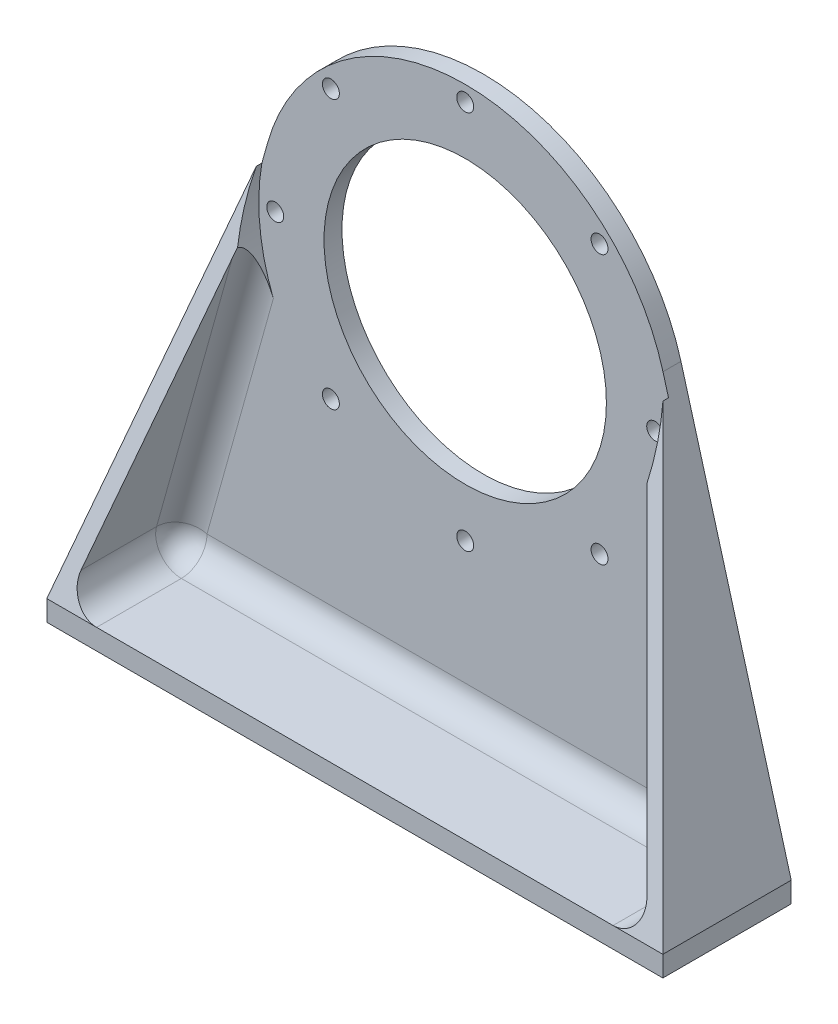
ISO-10303-21;
HEADER;
FILE_DESCRIPTION(('STEP AP214'),'2;1');
FILE_NAME('part.step','',(''),(''),'','','');
FILE_SCHEMA(('AUTOMOTIVE_DESIGN { 1 0 10303 214 1 1 1 1 }'));
ENDSEC;
DATA;
#1=APPLICATION_CONTEXT('core data for automotive mechanical design processes');
#2=APPLICATION_PROTOCOL_DEFINITION('international standard','automotive_design',2000,#1);
#3=PRODUCT_CONTEXT('',#1,'mechanical');
#4=PRODUCT('Part','Part','',(#3));
#5=PRODUCT_RELATED_PRODUCT_CATEGORY('part','',(#4));
#6=PRODUCT_DEFINITION_FORMATION('','',#4);
#7=PRODUCT_DEFINITION_CONTEXT('part definition',#1,'design');
#8=PRODUCT_DEFINITION('design','',#6,#7);
#9=PRODUCT_DEFINITION_SHAPE('','',#8);
#10=(LENGTH_UNIT() NAMED_UNIT(*) SI_UNIT(.MILLI.,.METRE.));
#11=(NAMED_UNIT(*) PLANE_ANGLE_UNIT() SI_UNIT($,.RADIAN.));
#12=(NAMED_UNIT(*) SI_UNIT($,.STERADIAN.) SOLID_ANGLE_UNIT());
#13=UNCERTAINTY_MEASURE_WITH_UNIT(LENGTH_MEASURE(1.E-05),#10,'distance_accuracy_value','');
#14=(GEOMETRIC_REPRESENTATION_CONTEXT(3) GLOBAL_UNCERTAINTY_ASSIGNED_CONTEXT((#13)) GLOBAL_UNIT_ASSIGNED_CONTEXT((#10,
#11,#12)) REPRESENTATION_CONTEXT('',''));
#15=CARTESIAN_POINT('',(0.,0.,0.));
#16=DIRECTION('',(0.,0.,1.));
#17=DIRECTION('',(1.,0.,0.));
#18=AXIS2_PLACEMENT_3D('',#15,#16,#17);
#19=CARTESIAN_POINT('',(37.,-1.29184809537196E-13,25.));
#20=DIRECTION('',(0.,0.,-1.));
#21=DIRECTION('',(-1.,0.,0.));
#22=AXIS2_PLACEMENT_3D('',#19,#20,#21);
#23=CYLINDRICAL_SURFACE('',#22,1.65);
#24=CARTESIAN_POINT('',(37.,-1.29184809537196E-13,0.));
#25=DIRECTION('',(0.,0.,1.));
#26=DIRECTION('',(1.,0.,0.));
#27=AXIS2_PLACEMENT_3D('',#24,#25,#26);
#28=CIRCLE('',#27,1.65);
#29=CARTESIAN_POINT('',(38.65,-1.29184809537196E-13,0.));
#30=VERTEX_POINT('',#29);
#31=EDGE_CURVE('E448',#30,#30,#28,.T.);
#32=ORIENTED_EDGE('',*,*,#31,.F.);
#33=EDGE_LOOP('',(#32));
#34=FACE_BOUND('',#33,.T.);
#35=CARTESIAN_POINT('',(37.,-1.29184809537196E-13,3.5));
#36=DIRECTION('',(0.,0.,1.));
#37=DIRECTION('',(1.,0.,0.));
#38=AXIS2_PLACEMENT_3D('',#35,#36,#37);
#39=CIRCLE('',#38,1.65);
#40=CARTESIAN_POINT('',(38.65,-1.29184809537196E-13,3.5));
#41=VERTEX_POINT('',#40);
#42=EDGE_CURVE('E396',#41,#41,#39,.T.);
#43=ORIENTED_EDGE('',*,*,#42,.T.);
#44=EDGE_LOOP('',(#43));
#45=FACE_BOUND('',#44,.T.);
#46=ADVANCED_FACE('F47',(#34,#45),#23,.F.);
#47=CARTESIAN_POINT('',(35.6318868512635,9.96838198599715,25.));
#48=DIRECTION('',(-0.963023968953069,-0.269415729351274,0.));
#49=DIRECTION('',(0.269415729351274,-0.963023968953069,0.));
#50=AXIS2_PLACEMENT_3D('',#47,#48,#49);
#51=PLANE('',#50);
#52=DIRECTION('',(-0.269415729351274,0.963023968953069,0.));
#53=VECTOR('',#52,1.);
#54=CARTESIAN_POINT('',(56.8848127391249,-66.,8.5));
#55=LINE('',#54,#53);
#56=CARTESIAN_POINT('',(40.4008973674516,-7.07840086642601,8.5));
#57=VERTEX_POINT('',#56);
#58=CARTESIAN_POINT('',(55.1091530691742,-59.6529213532436,8.5));
#59=VERTEX_POINT('',#58);
#60=EDGE_CURVE('E175',#57,#59,#55,.F.);
#61=ORIENTED_EDGE('',*,*,#60,.T.);
#62=DIRECTION('',(0.,0.,-1.));
#63=VECTOR('',#62,1.);
#64=CARTESIAN_POINT('',(55.1091530691742,-59.6529213532436,25.));
#65=LINE('',#64,#63);
#66=CARTESIAN_POINT('',(55.1091530691742,-59.6529213532436,23.222607681878));
#67=VERTEX_POINT('',#66);
#68=EDGE_CURVE('E183',#59,#67,#65,.F.);
#69=ORIENTED_EDGE('',*,*,#68,.T.);
#70=DIRECTION('',(-0.260122806675795,0.929806505000007,-0.260376628572496));
#71=VECTOR('',#70,1.);
#72=CARTESIAN_POINT('',(37.072749974743,4.81803041880216,5.16860507704013));
#73=LINE('',#72,#71);
#74=EDGE_CURVE('E159',#67,#57,#73,.T.);
#75=ORIENTED_EDGE('',*,*,#74,.T.);
#76=EDGE_LOOP('',(#61,#69,#75));
#77=FACE_BOUND('',#76,.T.);
#78=ADVANCED_FACE('F273',(#77),#51,.T.);
#79=CARTESIAN_POINT('',(-35.6318868512635,9.96838198599715,25.));
#80=DIRECTION('',(-0.963023968953069,0.269415729351274,0.));
#81=DIRECTION('',(-0.269415729351274,-0.963023968953069,0.));
#82=AXIS2_PLACEMENT_3D('',#79,#80,#81);
#83=PLANE('',#82);
#84=DIRECTION('',(0.260122806675795,0.929806505000007,-0.260376628572496));
#85=VECTOR('',#84,1.);
#86=CARTESIAN_POINT('',(-37.072749974743,4.81803041880217,5.16860507704013));
#87=LINE('',#86,#85);
#88=CARTESIAN_POINT('',(-55.1091530691742,-59.6529213532436,23.222607681878));
#89=VERTEX_POINT('',#88);
#90=CARTESIAN_POINT('',(-40.4008973674516,-7.07840086642601,8.5));
#91=VERTEX_POINT('',#90);
#92=EDGE_CURVE('E345',#89,#91,#87,.T.);
#93=ORIENTED_EDGE('',*,*,#92,.F.);
#94=DIRECTION('',(0.,0.,-1.));
#95=VECTOR('',#94,1.);
#96=CARTESIAN_POINT('',(-55.1091530691742,-59.6529213532436,25.));
#97=LINE('',#96,#95);
#98=CARTESIAN_POINT('',(-55.1091530691742,-59.6529213532436,8.5));
#99=VERTEX_POINT('',#98);
#100=EDGE_CURVE('E177',#89,#99,#97,.T.);
#101=ORIENTED_EDGE('',*,*,#100,.T.);
#102=DIRECTION('',(0.269415729351274,0.963023968953069,0.));
#103=VECTOR('',#102,1.);
#104=CARTESIAN_POINT('',(-35.6318868512635,9.96838198599715,8.5));
#105=LINE('',#104,#103);
#106=EDGE_CURVE('E348',#99,#91,#105,.T.);
#107=ORIENTED_EDGE('',*,*,#106,.T.);
#108=EDGE_LOOP('',(#93,#101,#107));
#109=FACE_BOUND('',#108,.T.);
#110=ADVANCED_FACE('F269',(#109),#83,.F.);
#111=CARTESIAN_POINT('',(-37.,3.87554428611588E-13,25.));
#112=DIRECTION('',(0.,0.,-1.));
#113=DIRECTION('',(-1.,0.,0.));
#114=AXIS2_PLACEMENT_3D('',#111,#112,#113);
#115=CYLINDRICAL_SURFACE('',#114,1.65);
#116=CARTESIAN_POINT('',(-37.,3.87554428611588E-13,0.));
#117=DIRECTION('',(0.,0.,1.));
#118=DIRECTION('',(1.,0.,0.));
#119=AXIS2_PLACEMENT_3D('',#116,#117,#118);
#120=CIRCLE('',#119,1.65);
#121=CARTESIAN_POINT('',(-35.35,3.87554428611588E-13,0.));
#122=VERTEX_POINT('',#121);
#123=EDGE_CURVE('E452',#122,#122,#120,.T.);
#124=ORIENTED_EDGE('',*,*,#123,.F.);
#125=EDGE_LOOP('',(#124));
#126=FACE_BOUND('',#125,.T.);
#127=CARTESIAN_POINT('',(-37.,3.87554428611588E-13,3.5));
#128=DIRECTION('',(0.,0.,1.));
#129=DIRECTION('',(1.,0.,0.));
#130=AXIS2_PLACEMENT_3D('',#127,#128,#129);
#131=CIRCLE('',#130,1.65);
#132=CARTESIAN_POINT('',(-35.35,3.87554428611588E-13,3.5));
#133=VERTEX_POINT('',#132);
#134=EDGE_CURVE('E392',#133,#133,#131,.T.);
#135=ORIENTED_EDGE('',*,*,#134,.T.);
#136=EDGE_LOOP('',(#135));
#137=FACE_BOUND('',#136,.T.);
#138=ADVANCED_FACE('F272',(#126,#137),#115,.F.);
#139=CARTESIAN_POINT('',(38.5209587581228,10.776629174051,25.));
#140=DIRECTION('',(-0.963023968953069,-0.269415729351274,0.));
#141=DIRECTION('',(0.269415729351274,-0.963023968953069,0.));
#142=AXIS2_PLACEMENT_3D('',#139,#140,#141);
#143=PLANE('',#142);
#144=DIRECTION('',(0.,0.,-1.));
#145=VECTOR('',#144,1.);
#146=CARTESIAN_POINT('',(39.5999679133012,6.91972118408798,93.5));
#147=LINE('',#146,#145);
#148=CARTESIAN_POINT('',(39.5999679133012,6.91972118408802,4.58006202768055));
#149=VERTEX_POINT('',#148);
#150=CARTESIAN_POINT('',(39.5999679133012,6.91972118408798,3.5));
#151=VERTEX_POINT('',#150);
#152=EDGE_CURVE('E542',#149,#151,#147,.T.);
#153=ORIENTED_EDGE('',*,*,#152,.F.);
#154=DIRECTION('',(-0.260122806675795,0.929806505000007,-0.260376628572496));
#155=VECTOR('',#154,1.);
#156=CARTESIAN_POINT('',(39.9771515955895,5.5714816896224,4.95761375719576));
#157=LINE('',#156,#155);
#158=CARTESIAN_POINT('',(60.,-66.,25.));
#159=VERTEX_POINT('',#158);
#160=EDGE_CURVE('E350',#159,#149,#157,.T.);
#161=ORIENTED_EDGE('',*,*,#160,.F.);
#162=DIRECTION('',(0.,0.,-1.));
#163=VECTOR('',#162,1.);
#164=CARTESIAN_POINT('',(60.,-66.,25.));
#165=LINE('',#164,#163);
#166=CARTESIAN_POINT('',(60.,-66.,0.));
#167=VERTEX_POINT('',#166);
#168=EDGE_CURVE('E486',#159,#167,#165,.T.);
#169=ORIENTED_EDGE('',*,*,#168,.T.);
#170=DIRECTION('',(-0.269415729351274,0.963023968953069,0.));
#171=VECTOR('',#170,1.);
#172=CARTESIAN_POINT('',(38.5209587581228,10.776629174051,0.));
#173=LINE('',#172,#171);
#174=CARTESIAN_POINT('',(38.5209587581228,10.776629174051,0.));
#175=VERTEX_POINT('',#174);
#176=EDGE_CURVE('E428',#167,#175,#173,.T.);
#177=ORIENTED_EDGE('',*,*,#176,.T.);
#178=DIRECTION('',(0.,0.,-1.));
#179=VECTOR('',#178,1.);
#180=CARTESIAN_POINT('',(38.5209587581228,10.776629174051,25.));
#181=LINE('',#180,#179);
#182=CARTESIAN_POINT('',(38.5209587581228,10.776629174051,3.5));
#183=VERTEX_POINT('',#182);
#184=EDGE_CURVE('E482',#183,#175,#181,.T.);
#185=ORIENTED_EDGE('',*,*,#184,.F.);
#186=DIRECTION('',(-0.269415729351274,0.963023968953069,0.));
#187=VECTOR('',#186,1.);
#188=CARTESIAN_POINT('',(38.5209587581228,10.776629174051,3.5));
#189=LINE('',#188,#187);
#190=EDGE_CURVE('E548',#151,#183,#189,.T.);
#191=ORIENTED_EDGE('',*,*,#190,.F.);
#192=EDGE_LOOP('',(#153,#161,#169,#177,#185,#191));
#193=FACE_BOUND('',#192,.T.);
#194=ADVANCED_FACE('F277',(#193),#143,.F.);
#195=CARTESIAN_POINT('',(-38.5209587581227,10.776629174051,25.));
#196=DIRECTION('',(-0.963023968953069,0.269415729351274,0.));
#197=DIRECTION('',(-0.269415729351274,-0.963023968953069,0.));
#198=AXIS2_PLACEMENT_3D('',#195,#196,#197);
#199=PLANE('',#198);
#200=DIRECTION('',(0.260122806675795,0.929806505000007,-0.260376628572496));
#201=VECTOR('',#200,1.);
#202=CARTESIAN_POINT('',(-39.9771515955895,5.57148168962241,4.95761375719576));
#203=LINE('',#202,#201);
#204=CARTESIAN_POINT('',(-60.,-66.,25.));
#205=VERTEX_POINT('',#204);
#206=CARTESIAN_POINT('',(-39.5999679133012,6.91972118408798,4.58006202768056));
#207=VERTEX_POINT('',#206);
#208=EDGE_CURVE('E142',#205,#207,#203,.T.);
#209=ORIENTED_EDGE('',*,*,#208,.T.);
#210=DIRECTION('',(0.,0.,-1.));
#211=VECTOR('',#210,1.);
#212=CARTESIAN_POINT('',(-39.5999679133012,6.9197211840879,93.5));
#213=LINE('',#212,#211);
#214=CARTESIAN_POINT('',(-39.5999679133012,6.9197211840879,3.5));
#215=VERTEX_POINT('',#214);
#216=EDGE_CURVE('E565',#207,#215,#213,.T.);
#217=ORIENTED_EDGE('',*,*,#216,.T.);
#218=DIRECTION('',(0.269415729351274,0.963023968953069,0.));
#219=VECTOR('',#218,1.);
#220=CARTESIAN_POINT('',(-38.5209587581227,10.776629174051,3.5));
#221=LINE('',#220,#219);
#222=CARTESIAN_POINT('',(-38.5209587581228,10.776629174051,3.5));
#223=VERTEX_POINT('',#222);
#224=EDGE_CURVE('E557',#215,#223,#221,.T.);
#225=ORIENTED_EDGE('',*,*,#224,.T.);
#226=DIRECTION('',(0.,0.,-1.));
#227=VECTOR('',#226,1.);
#228=CARTESIAN_POINT('',(-38.5209587581227,10.776629174051,25.));
#229=LINE('',#228,#227);
#230=CARTESIAN_POINT('',(-38.5209587581227,10.776629174051,0.));
#231=VERTEX_POINT('',#230);
#232=EDGE_CURVE('E478',#223,#231,#229,.T.);
#233=ORIENTED_EDGE('',*,*,#232,.T.);
#234=DIRECTION('',(0.269415729351274,0.963023968953069,0.));
#235=VECTOR('',#234,1.);
#236=CARTESIAN_POINT('',(-38.5209587581227,10.776629174051,0.));
#237=LINE('',#236,#235);
#238=CARTESIAN_POINT('',(-60.,-66.,0.));
#239=VERTEX_POINT('',#238);
#240=EDGE_CURVE('E436',#239,#231,#237,.T.);
#241=ORIENTED_EDGE('',*,*,#240,.F.);
#242=DIRECTION('',(0.,0.,-1.));
#243=VECTOR('',#242,1.);
#244=CARTESIAN_POINT('',(-60.,-66.,25.));
#245=LINE('',#244,#243);
#246=EDGE_CURVE('E474',#205,#239,#245,.T.);
#247=ORIENTED_EDGE('',*,*,#246,.F.);
#248=EDGE_LOOP('',(#209,#217,#225,#233,#241,#247));
#249=FACE_BOUND('',#248,.T.);
#250=ADVANCED_FACE('F229',(#249),#199,.T.);
#251=CARTESIAN_POINT('',(116.,-66.,25.));
#252=DIRECTION('',(0.,0.269659511355382,0.962955735190137));
#253=DIRECTION('',(0.,-0.962955735190137,0.269659511355382));
#254=AXIS2_PLACEMENT_3D('',#251,#252,#253);
#255=PLANE('',#254);
#256=DIRECTION('',(-1.,0.,0.));
#257=VECTOR('',#256,1.);
#258=CARTESIAN_POINT('',(116.,-66.,25.));
#259=LINE('',#258,#257);
#260=CARTESIAN_POINT('',(-50.2940332244089,-66.,25.));
#261=VERTEX_POINT('',#260);
#262=EDGE_CURVE('E80',#261,#205,#259,.T.);
#263=ORIENTED_EDGE('',*,*,#262,.F.);
#264=CARTESIAN_POINT('',(-50.2940332244089,-61.,23.5998343355724));
#265=DIRECTION('',(0.,0.269659511355382,0.962955735190137));
#266=DIRECTION('',(0.,0.962955735190137,-0.269659511355382));
#267=AXIS2_PLACEMENT_3D('',#264,#265,#266);
#268=ELLIPSE('',#267,5.19234666483683,5.);
#269=EDGE_CURVE('E164',#261,#89,#268,.F.);
#270=ORIENTED_EDGE('',*,*,#269,.T.);
#271=ORIENTED_EDGE('',*,*,#92,.T.);
#272=CARTESIAN_POINT('',(-35.2089185993264,-7.078400866426,8.5));
#273=DIRECTION('',(0.,0.269659511355382,0.962955735190137));
#274=DIRECTION('',(0.278987102398765,0.924721432157256,-0.25895263969339));
#275=AXIS2_PLACEMENT_3D('',#272,#273,#274);
#276=ELLIPSE('',#275,19.2538314040136,5.);
#277=CARTESIAN_POINT('',(-39.8576103237932,-5.23554192769497,7.98393843792107));
#278=VERTEX_POINT('',#277);
#279=EDGE_CURVE('E163',#91,#278,#276,.F.);
#280=ORIENTED_EDGE('',*,*,#279,.T.);
#281=CARTESIAN_POINT('',(0.,0.,6.51781322955511));
#282=DIRECTION('',(0.,0.269659511355382,0.962955735190137));
#283=DIRECTION('',(0.,0.962955735190137,-0.269659511355382));
#284=AXIS2_PLACEMENT_3D('',#281,#282,#283);
#285=ELLIPSE('',#284,41.7464671852881,40.2);
#286=EDGE_CURVE('E547',#278,#207,#285,.F.);
#287=ORIENTED_EDGE('',*,*,#286,.T.);
#288=ORIENTED_EDGE('',*,*,#208,.F.);
#289=EDGE_LOOP('',(#263,#270,#271,#280,#287,#288));
#290=FACE_BOUND('',#289,.T.);
#291=ADVANCED_FACE('F225',(#290),#255,.T.);
#292=ORIENTED_EDGE('',*,*,#160,.T.);
#293=CARTESIAN_POINT('',(0.,0.,6.51781322955511));
#294=DIRECTION('',(0.,0.269659511355382,0.962955735190137));
#295=DIRECTION('',(0.,0.962955735190137,-0.269659511355382));
#296=AXIS2_PLACEMENT_3D('',#293,#294,#295);
#297=ELLIPSE('',#296,41.7464671852881,40.2);
#298=CARTESIAN_POINT('',(39.8576103237932,-5.23554192769498,7.98393843792108));
#299=VERTEX_POINT('',#298);
#300=EDGE_CURVE('E67',#149,#299,#297,.F.);
#301=ORIENTED_EDGE('',*,*,#300,.T.);
#302=CARTESIAN_POINT('',(35.2089185993264,-7.078400866426,8.5));
#303=DIRECTION('',(0.,0.269659511355382,0.962955735190137));
#304=DIRECTION('',(0.278987102398765,-0.924721432157256,0.25895263969339));
#305=AXIS2_PLACEMENT_3D('',#302,#303,#304);
#306=ELLIPSE('',#305,19.2538314040136,5.);
#307=EDGE_CURVE('E11',#299,#57,#306,.F.);
#308=ORIENTED_EDGE('',*,*,#307,.T.);
#309=ORIENTED_EDGE('',*,*,#74,.F.);
#310=CARTESIAN_POINT('',(50.2940332244089,-61.,23.5998343355724));
#311=DIRECTION('',(0.,0.269659511355382,0.962955735190137));
#312=DIRECTION('',(0.,-0.962955735190137,0.269659511355382));
#313=AXIS2_PLACEMENT_3D('',#310,#311,#312);
#314=ELLIPSE('',#313,5.19234666483683,5.);
#315=CARTESIAN_POINT('',(50.2940332244089,-66.,25.));
#316=VERTEX_POINT('',#315);
#317=EDGE_CURVE('E156',#67,#316,#314,.F.);
#318=ORIENTED_EDGE('',*,*,#317,.T.);
#319=EDGE_CURVE('E129',#159,#316,#259,.T.);
#320=ORIENTED_EDGE('',*,*,#319,.F.);
#321=EDGE_LOOP('',(#292,#301,#308,#309,#318,#320));
#322=FACE_BOUND('',#321,.T.);
#323=ADVANCED_FACE('F157',(#322),#255,.T.);
#324=CARTESIAN_POINT('',(-26.1629509039019,26.1629509039026,25.));
#325=DIRECTION('',(0.,0.,-1.));
#326=DIRECTION('',(-1.,0.,0.));
#327=AXIS2_PLACEMENT_3D('',#324,#325,#326);
#328=CYLINDRICAL_SURFACE('',#327,1.65);
#329=CARTESIAN_POINT('',(-26.1629509039019,26.1629509039026,0.));
#330=DIRECTION('',(0.,0.,1.));
#331=DIRECTION('',(1.,0.,0.));
#332=AXIS2_PLACEMENT_3D('',#329,#330,#331);
#333=CIRCLE('',#332,1.65);
#334=CARTESIAN_POINT('',(-24.5129509039019,26.1629509039026,0.));
#335=VERTEX_POINT('',#334);
#336=EDGE_CURVE('E456',#335,#335,#333,.T.);
#337=ORIENTED_EDGE('',*,*,#336,.F.);
#338=EDGE_LOOP('',(#337));
#339=FACE_BOUND('',#338,.T.);
#340=CARTESIAN_POINT('',(-26.1629509039019,26.1629509039026,3.5));
#341=DIRECTION('',(0.,0.,1.));
#342=DIRECTION('',(1.,0.,0.));
#343=AXIS2_PLACEMENT_3D('',#340,#341,#342);
#344=CIRCLE('',#343,1.65);
#345=CARTESIAN_POINT('',(-24.5129509039019,26.1629509039026,3.5));
#346=VERTEX_POINT('',#345);
#347=EDGE_CURVE('E388',#346,#346,#344,.T.);
#348=ORIENTED_EDGE('',*,*,#347,.T.);
#349=EDGE_LOOP('',(#348));
#350=FACE_BOUND('',#349,.T.);
#351=ADVANCED_FACE('F264',(#339,#350),#328,.F.);
#352=CARTESIAN_POINT('',(0.,37.,25.));
#353=DIRECTION('',(0.,0.,-1.));
#354=DIRECTION('',(-1.,0.,0.));
#355=AXIS2_PLACEMENT_3D('',#352,#353,#354);
#356=CYLINDRICAL_SURFACE('',#355,1.65);
#357=CARTESIAN_POINT('',(0.,37.,0.));
#358=DIRECTION('',(0.,0.,1.));
#359=DIRECTION('',(1.,0.,0.));
#360=AXIS2_PLACEMENT_3D('',#357,#358,#359);
#361=CIRCLE('',#360,1.65);
#362=CARTESIAN_POINT('',(1.65,37.,0.));
#363=VERTEX_POINT('',#362);
#364=EDGE_CURVE('E460',#363,#363,#361,.T.);
#365=ORIENTED_EDGE('',*,*,#364,.F.);
#366=EDGE_LOOP('',(#365));
#367=FACE_BOUND('',#366,.T.);
#368=CARTESIAN_POINT('',(0.,37.,3.5));
#369=DIRECTION('',(0.,0.,1.));
#370=DIRECTION('',(1.,0.,0.));
#371=AXIS2_PLACEMENT_3D('',#368,#369,#370);
#372=CIRCLE('',#371,1.65);
#373=CARTESIAN_POINT('',(1.65,37.,3.5));
#374=VERTEX_POINT('',#373);
#375=EDGE_CURVE('E384',#374,#374,#372,.T.);
#376=ORIENTED_EDGE('',*,*,#375,.T.);
#377=EDGE_LOOP('',(#376));
#378=FACE_BOUND('',#377,.T.);
#379=ADVANCED_FACE('F261',(#367,#378),#356,.F.);
#380=CARTESIAN_POINT('',(0.,0.,25.));
#381=DIRECTION('',(0.,0.,-1.));
#382=DIRECTION('',(-1.,0.,0.));
#383=AXIS2_PLACEMENT_3D('',#380,#381,#382);
#384=CYLINDRICAL_SURFACE('',#383,40.);
#385=CARTESIAN_POINT('',(0.,0.,3.5));
#386=DIRECTION('',(0.,0.,1.));
#387=DIRECTION('',(1.,0.,0.));
#388=AXIS2_PLACEMENT_3D('',#385,#386,#387);
#389=CIRCLE('',#388,40.);
#390=EDGE_CURVE('E354',#183,#223,#389,.T.);
#391=ORIENTED_EDGE('',*,*,#390,.F.);
#392=ORIENTED_EDGE('',*,*,#184,.T.);
#393=CARTESIAN_POINT('',(0.,0.,0.));
#394=DIRECTION('',(0.,0.,1.));
#395=DIRECTION('',(1.,0.,0.));
#396=AXIS2_PLACEMENT_3D('',#393,#394,#395);
#397=CIRCLE('',#396,40.);
#398=EDGE_CURVE('E432',#175,#231,#397,.T.);
#399=ORIENTED_EDGE('',*,*,#398,.T.);
#400=ORIENTED_EDGE('',*,*,#232,.F.);
#401=EDGE_LOOP('',(#391,#392,#399,#400));
#402=FACE_BOUND('',#401,.T.);
#403=ADVANCED_FACE('F259',(#402),#384,.T.);
#404=CARTESIAN_POINT('',(26.1629509039023,26.1629509039022,25.));
#405=DIRECTION('',(0.,0.,-1.));
#406=DIRECTION('',(-1.,0.,0.));
#407=AXIS2_PLACEMENT_3D('',#404,#405,#406);
#408=CYLINDRICAL_SURFACE('',#407,1.65);
#409=CARTESIAN_POINT('',(26.1629509039023,26.1629509039022,0.));
#410=DIRECTION('',(0.,0.,1.));
#411=DIRECTION('',(1.,0.,0.));
#412=AXIS2_PLACEMENT_3D('',#409,#410,#411);
#413=CIRCLE('',#412,1.65);
#414=CARTESIAN_POINT('',(27.8129509039023,26.1629509039022,0.));
#415=VERTEX_POINT('',#414);
#416=EDGE_CURVE('E418',#415,#415,#413,.T.);
#417=ORIENTED_EDGE('',*,*,#416,.F.);
#418=EDGE_LOOP('',(#417));
#419=FACE_BOUND('',#418,.T.);
#420=CARTESIAN_POINT('',(26.1629509039023,26.1629509039022,3.5));
#421=DIRECTION('',(0.,0.,1.));
#422=DIRECTION('',(1.,0.,0.));
#423=AXIS2_PLACEMENT_3D('',#420,#421,#422);
#424=CIRCLE('',#423,1.65);
#425=CARTESIAN_POINT('',(27.8129509039023,26.1629509039022,3.5));
#426=VERTEX_POINT('',#425);
#427=EDGE_CURVE('E380',#426,#426,#424,.T.);
#428=ORIENTED_EDGE('',*,*,#427,.T.);
#429=EDGE_LOOP('',(#428));
#430=FACE_BOUND('',#429,.T.);
#431=ADVANCED_FACE('F252',(#419,#430),#408,.F.);
#432=CARTESIAN_POINT('',(0.,0.,25.));
#433=DIRECTION('',(0.,0.,1.));
#434=DIRECTION('',(1.,0.,0.));
#435=AXIS2_PLACEMENT_3D('',#432,#433,#434);
#436=PLANE('',#435);
#437=DIRECTION('',(0.,1.,0.));
#438=VECTOR('',#437,1.);
#439=CARTESIAN_POINT('',(60.,0.,25.));
#440=LINE('',#439,#438);
#441=CARTESIAN_POINT('',(60.,-70.,25.));
#442=VERTEX_POINT('',#441);
#443=EDGE_CURVE('E137',#442,#159,#440,.T.);
#444=ORIENTED_EDGE('',*,*,#443,.T.);
#445=ORIENTED_EDGE('',*,*,#319,.T.);
#446=DIRECTION('',(1.,0.,0.));
#447=VECTOR('',#446,1.);
#448=CARTESIAN_POINT('',(0.,-66.,25.));
#449=LINE('',#448,#447);
#450=EDGE_CURVE('E132',#261,#316,#449,.T.);
#451=ORIENTED_EDGE('',*,*,#450,.F.);
#452=ORIENTED_EDGE('',*,*,#262,.T.);
#453=DIRECTION('',(0.,1.,0.));
#454=VECTOR('',#453,1.);
#455=CARTESIAN_POINT('',(-60.,0.,25.));
#456=LINE('',#455,#454);
#457=CARTESIAN_POINT('',(-60.,-70.,25.));
#458=VERTEX_POINT('',#457);
#459=EDGE_CURVE('E417',#458,#205,#456,.T.);
#460=ORIENTED_EDGE('',*,*,#459,.F.);
#461=DIRECTION('',(-1.,0.,0.));
#462=VECTOR('',#461,1.);
#463=CARTESIAN_POINT('',(0.,-70.,25.));
#464=LINE('',#463,#462);
#465=EDGE_CURVE('E152',#442,#458,#464,.T.);
#466=ORIENTED_EDGE('',*,*,#465,.F.);
#467=EDGE_LOOP('',(#444,#445,#451,#452,#460,#466));
#468=FACE_BOUND('',#467,.T.);
#469=ADVANCED_FACE('F131',(#468),#436,.T.);
#470=CARTESIAN_POINT('',(0.,-66.,25.));
#471=DIRECTION('',(0.,1.,0.));
#472=DIRECTION('',(0.,0.,1.));
#473=AXIS2_PLACEMENT_3D('',#470,#471,#472);
#474=PLANE('',#473);
#475=DIRECTION('',(1.,0.,0.));
#476=VECTOR('',#475,1.);
#477=CARTESIAN_POINT('',(-56.8848127391249,-66.,8.5));
#478=LINE('',#477,#476);
#479=CARTESIAN_POINT('',(50.2940332244089,-66.,8.5));
#480=VERTEX_POINT('',#479);
#481=CARTESIAN_POINT('',(-50.2940332244089,-66.,8.5));
#482=VERTEX_POINT('',#481);
#483=EDGE_CURVE('E171',#480,#482,#478,.F.);
#484=ORIENTED_EDGE('',*,*,#483,.T.);
#485=DIRECTION('',(0.,0.,-1.));
#486=VECTOR('',#485,1.);
#487=CARTESIAN_POINT('',(-50.2940332244089,-66.,25.));
#488=LINE('',#487,#486);
#489=EDGE_CURVE('E149',#482,#261,#488,.F.);
#490=ORIENTED_EDGE('',*,*,#489,.T.);
#491=ORIENTED_EDGE('',*,*,#450,.T.);
#492=DIRECTION('',(0.,0.,-1.));
#493=VECTOR('',#492,1.);
#494=CARTESIAN_POINT('',(50.2940332244089,-66.,3.5));
#495=LINE('',#494,#493);
#496=EDGE_CURVE('E147',#316,#480,#495,.T.);
#497=ORIENTED_EDGE('',*,*,#496,.T.);
#498=EDGE_LOOP('',(#484,#490,#491,#497));
#499=FACE_BOUND('',#498,.T.);
#500=ADVANCED_FACE('F145',(#499),#474,.T.);
#501=CARTESIAN_POINT('',(60.,0.,25.));
#502=DIRECTION('',(-1.,0.,0.));
#503=DIRECTION('',(0.,0.,1.));
#504=AXIS2_PLACEMENT_3D('',#501,#502,#503);
#505=PLANE('',#504);
#506=DIRECTION('',(0.,1.,0.));
#507=VECTOR('',#506,1.);
#508=CARTESIAN_POINT('',(60.,0.,0.));
#509=LINE('',#508,#507);
#510=CARTESIAN_POINT('',(60.,-70.,0.));
#511=VERTEX_POINT('',#510);
#512=EDGE_CURVE('E400',#511,#167,#509,.T.);
#513=ORIENTED_EDGE('',*,*,#512,.T.);
#514=ORIENTED_EDGE('',*,*,#168,.F.);
#515=ORIENTED_EDGE('',*,*,#443,.F.);
#516=DIRECTION('',(0.,0.,-1.));
#517=VECTOR('',#516,1.);
#518=CARTESIAN_POINT('',(60.,-70.,25.));
#519=LINE('',#518,#517);
#520=EDGE_CURVE('E151',#442,#511,#519,.T.);
#521=ORIENTED_EDGE('',*,*,#520,.T.);
#522=EDGE_LOOP('',(#513,#514,#515,#521));
#523=FACE_BOUND('',#522,.T.);
#524=ADVANCED_FACE('F281',(#523),#505,.F.);
#525=CARTESIAN_POINT('',(-60.,0.,25.));
#526=DIRECTION('',(-1.,0.,0.));
#527=DIRECTION('',(0.,0.,1.));
#528=AXIS2_PLACEMENT_3D('',#525,#526,#527);
#529=PLANE('',#528);
#530=DIRECTION('',(0.,1.,0.));
#531=VECTOR('',#530,1.);
#532=CARTESIAN_POINT('',(-60.,0.,0.));
#533=LINE('',#532,#531);
#534=CARTESIAN_POINT('',(-60.,-70.,0.));
#535=VERTEX_POINT('',#534);
#536=EDGE_CURVE('E440',#535,#239,#533,.T.);
#537=ORIENTED_EDGE('',*,*,#536,.F.);
#538=DIRECTION('',(0.,0.,-1.));
#539=VECTOR('',#538,1.);
#540=CARTESIAN_POINT('',(-60.,-70.,25.));
#541=LINE('',#540,#539);
#542=EDGE_CURVE('E470',#458,#535,#541,.T.);
#543=ORIENTED_EDGE('',*,*,#542,.F.);
#544=ORIENTED_EDGE('',*,*,#459,.T.);
#545=ORIENTED_EDGE('',*,*,#246,.T.);
#546=EDGE_LOOP('',(#537,#543,#544,#545));
#547=FACE_BOUND('',#546,.T.);
#548=ADVANCED_FACE('F290',(#547),#529,.T.);
#549=CARTESIAN_POINT('',(0.,-70.,25.));
#550=DIRECTION('',(0.,-1.,0.));
#551=DIRECTION('',(0.,0.,-1.));
#552=AXIS2_PLACEMENT_3D('',#549,#550,#551);
#553=PLANE('',#552);
#554=DIRECTION('',(-1.,0.,0.));
#555=VECTOR('',#554,1.);
#556=CARTESIAN_POINT('',(0.,-70.,0.));
#557=LINE('',#556,#555);
#558=EDGE_CURVE('E444',#511,#535,#557,.T.);
#559=ORIENTED_EDGE('',*,*,#558,.F.);
#560=ORIENTED_EDGE('',*,*,#520,.F.);
#561=ORIENTED_EDGE('',*,*,#465,.T.);
#562=ORIENTED_EDGE('',*,*,#542,.T.);
#563=EDGE_LOOP('',(#559,#560,#561,#562));
#564=FACE_BOUND('',#563,.T.);
#565=ADVANCED_FACE('F255',(#564),#553,.T.);
#566=CARTESIAN_POINT('',(0.,0.,0.));
#567=DIRECTION('',(0.,0.,1.));
#568=DIRECTION('',(1.,0.,0.));
#569=AXIS2_PLACEMENT_3D('',#566,#567,#568);
#570=PLANE('',#569);
#571=ORIENTED_EDGE('',*,*,#416,.T.);
#572=EDGE_LOOP('',(#571));
#573=FACE_BOUND('',#572,.T.);
#574=ORIENTED_EDGE('',*,*,#364,.T.);
#575=EDGE_LOOP('',(#574));
#576=FACE_BOUND('',#575,.T.);
#577=ORIENTED_EDGE('',*,*,#336,.T.);
#578=EDGE_LOOP('',(#577));
#579=FACE_BOUND('',#578,.T.);
#580=ORIENTED_EDGE('',*,*,#31,.T.);
#581=EDGE_LOOP('',(#580));
#582=FACE_BOUND('',#581,.T.);
#583=ORIENTED_EDGE('',*,*,#123,.T.);
#584=EDGE_LOOP('',(#583));
#585=FACE_BOUND('',#584,.T.);
#586=ORIENTED_EDGE('',*,*,#512,.F.);
#587=ORIENTED_EDGE('',*,*,#558,.T.);
#588=ORIENTED_EDGE('',*,*,#536,.T.);
#589=ORIENTED_EDGE('',*,*,#240,.T.);
#590=ORIENTED_EDGE('',*,*,#398,.F.);
#591=ORIENTED_EDGE('',*,*,#176,.F.);
#592=EDGE_LOOP('',(#586,#587,#588,#589,#590,#591));
#593=FACE_BOUND('',#592,.T.);
#594=CARTESIAN_POINT('',(-26.1629509039025,-26.162950903902,0.));
#595=DIRECTION('',(0.,0.,1.));
#596=DIRECTION('',(1.,0.,0.));
#597=AXIS2_PLACEMENT_3D('',#594,#595,#596);
#598=CIRCLE('',#597,1.65);
#599=CARTESIAN_POINT('',(-24.5129509039025,-26.162950903902,0.));
#600=VERTEX_POINT('',#599);
#601=EDGE_CURVE('E362',#600,#600,#598,.T.);
#602=ORIENTED_EDGE('',*,*,#601,.T.);
#603=EDGE_LOOP('',(#602));
#604=FACE_BOUND('',#603,.T.);
#605=CARTESIAN_POINT('',(-2.58369619074392E-13,-37.,0.));
#606=DIRECTION('',(0.,0.,1.));
#607=DIRECTION('',(1.,0.,0.));
#608=AXIS2_PLACEMENT_3D('',#605,#606,#607);
#609=CIRCLE('',#608,1.65);
#610=CARTESIAN_POINT('',(1.64999999999974,-37.,0.));
#611=VERTEX_POINT('',#610);
#612=EDGE_CURVE('E404',#611,#611,#609,.T.);
#613=ORIENTED_EDGE('',*,*,#612,.T.);
#614=EDGE_LOOP('',(#613));
#615=FACE_BOUND('',#614,.T.);
#616=CARTESIAN_POINT('',(26.1629509039021,-26.1629509039024,0.));
#617=DIRECTION('',(0.,0.,1.));
#618=DIRECTION('',(1.,0.,0.));
#619=AXIS2_PLACEMENT_3D('',#616,#617,#618);
#620=CIRCLE('',#619,1.65);
#621=CARTESIAN_POINT('',(27.8129509039021,-26.1629509039024,0.));
#622=VERTEX_POINT('',#621);
#623=EDGE_CURVE('E408',#622,#622,#620,.T.);
#624=ORIENTED_EDGE('',*,*,#623,.T.);
#625=EDGE_LOOP('',(#624));
#626=FACE_BOUND('',#625,.T.);
#627=CARTESIAN_POINT('',(0.,0.,0.));
#628=DIRECTION('',(0.,0.,1.));
#629=DIRECTION('',(1.,0.,0.));
#630=AXIS2_PLACEMENT_3D('',#627,#628,#629);
#631=CIRCLE('',#630,27.5);
#632=CARTESIAN_POINT('',(27.5,0.,0.));
#633=VERTEX_POINT('',#632);
#634=EDGE_CURVE('E368',#633,#633,#631,.T.);
#635=ORIENTED_EDGE('',*,*,#634,.T.);
#636=EDGE_LOOP('',(#635));
#637=FACE_BOUND('',#636,.T.);
#638=ADVANCED_FACE('F238',(#573,#576,#579,#582,#585,#593,#604,#615,#626,#637),#570,.F.);
#639=CARTESIAN_POINT('',(0.,0.,3.5));
#640=DIRECTION('',(0.,0.,-1.));
#641=DIRECTION('',(-1.,0.,0.));
#642=AXIS2_PLACEMENT_3D('',#639,#640,#641);
#643=CYLINDRICAL_SURFACE('',#642,27.5);
#644=CARTESIAN_POINT('',(0.,0.,3.5));
#645=DIRECTION('',(0.,0.,1.));
#646=DIRECTION('',(1.,0.,0.));
#647=AXIS2_PLACEMENT_3D('',#644,#645,#646);
#648=CIRCLE('',#647,27.5);
#649=CARTESIAN_POINT('',(27.5,0.,3.5));
#650=VERTEX_POINT('',#649);
#651=EDGE_CURVE('E376',#650,#650,#648,.T.);
#652=ORIENTED_EDGE('',*,*,#651,.T.);
#653=EDGE_LOOP('',(#652));
#654=FACE_BOUND('',#653,.T.);
#655=ORIENTED_EDGE('',*,*,#634,.F.);
#656=EDGE_LOOP('',(#655));
#657=FACE_BOUND('',#656,.T.);
#658=ADVANCED_FACE('F234',(#654,#657),#643,.F.);
#659=CARTESIAN_POINT('',(26.1629509039021,-26.1629509039024,3.5));
#660=DIRECTION('',(0.,0.,-1.));
#661=DIRECTION('',(-1.,0.,0.));
#662=AXIS2_PLACEMENT_3D('',#659,#660,#661);
#663=CYLINDRICAL_SURFACE('',#662,1.65);
#664=CARTESIAN_POINT('',(26.1629509039021,-26.1629509039024,3.5));
#665=DIRECTION('',(0.,0.,1.));
#666=DIRECTION('',(1.,0.,0.));
#667=AXIS2_PLACEMENT_3D('',#664,#665,#666);
#668=CIRCLE('',#667,1.65);
#669=CARTESIAN_POINT('',(27.8129509039021,-26.1629509039024,3.5));
#670=VERTEX_POINT('',#669);
#671=EDGE_CURVE('E372',#670,#670,#668,.T.);
#672=ORIENTED_EDGE('',*,*,#671,.T.);
#673=EDGE_LOOP('',(#672));
#674=FACE_BOUND('',#673,.T.);
#675=ORIENTED_EDGE('',*,*,#623,.F.);
#676=EDGE_LOOP('',(#675));
#677=FACE_BOUND('',#676,.T.);
#678=ADVANCED_FACE('F237',(#674,#677),#663,.F.);
#679=CARTESIAN_POINT('',(-2.58369619074392E-13,-37.,3.5));
#680=DIRECTION('',(0.,0.,-1.));
#681=DIRECTION('',(-1.,0.,0.));
#682=AXIS2_PLACEMENT_3D('',#679,#680,#681);
#683=CYLINDRICAL_SURFACE('',#682,1.65);
#684=CARTESIAN_POINT('',(-2.58369619074392E-13,-37.,3.5));
#685=DIRECTION('',(0.,0.,1.));
#686=DIRECTION('',(1.,0.,0.));
#687=AXIS2_PLACEMENT_3D('',#684,#685,#686);
#688=CIRCLE('',#687,1.65);
#689=CARTESIAN_POINT('',(1.64999999999974,-37.,3.5));
#690=VERTEX_POINT('',#689);
#691=EDGE_CURVE('E367',#690,#690,#688,.T.);
#692=ORIENTED_EDGE('',*,*,#691,.T.);
#693=EDGE_LOOP('',(#692));
#694=FACE_BOUND('',#693,.T.);
#695=ORIENTED_EDGE('',*,*,#612,.F.);
#696=EDGE_LOOP('',(#695));
#697=FACE_BOUND('',#696,.T.);
#698=ADVANCED_FACE('F242',(#694,#697),#683,.F.);
#699=CARTESIAN_POINT('',(-26.1629509039025,-26.162950903902,3.5));
#700=DIRECTION('',(0.,0.,-1.));
#701=DIRECTION('',(-1.,0.,0.));
#702=AXIS2_PLACEMENT_3D('',#699,#700,#701);
#703=CYLINDRICAL_SURFACE('',#702,1.65);
#704=CARTESIAN_POINT('',(-26.1629509039025,-26.162950903902,3.5));
#705=DIRECTION('',(0.,0.,1.));
#706=DIRECTION('',(1.,0.,0.));
#707=AXIS2_PLACEMENT_3D('',#704,#705,#706);
#708=CIRCLE('',#707,1.65);
#709=CARTESIAN_POINT('',(-24.5129509039025,-26.162950903902,3.5));
#710=VERTEX_POINT('',#709);
#711=EDGE_CURVE('E363',#710,#710,#708,.T.);
#712=ORIENTED_EDGE('',*,*,#711,.T.);
#713=EDGE_LOOP('',(#712));
#714=FACE_BOUND('',#713,.T.);
#715=ORIENTED_EDGE('',*,*,#601,.F.);
#716=EDGE_LOOP('',(#715));
#717=FACE_BOUND('',#716,.T.);
#718=ADVANCED_FACE('F232',(#714,#717),#703,.F.);
#719=CARTESIAN_POINT('',(0.,0.,3.5));
#720=DIRECTION('',(0.,0.,1.));
#721=DIRECTION('',(1.,0.,0.));
#722=AXIS2_PLACEMENT_3D('',#719,#720,#721);
#723=PLANE('',#722);
#724=ORIENTED_EDGE('',*,*,#42,.F.);
#725=EDGE_LOOP('',(#724));
#726=FACE_BOUND('',#725,.T.);
#727=ORIENTED_EDGE('',*,*,#134,.F.);
#728=EDGE_LOOP('',(#727));
#729=FACE_BOUND('',#728,.T.);
#730=CARTESIAN_POINT('',(0.,0.,3.5));
#731=DIRECTION('',(0.,0.,1.));
#732=DIRECTION('',(1.,0.,0.));
#733=AXIS2_PLACEMENT_3D('',#730,#731,#732);
#734=CIRCLE('',#733,40.2);
#735=CARTESIAN_POINT('',(-37.3721560754064,-14.8108727047215,3.5));
#736=VERTEX_POINT('',#735);
#737=EDGE_CURVE('E122',#215,#736,#734,.T.);
#738=ORIENTED_EDGE('',*,*,#737,.T.);
#739=DIRECTION('',(0.269415729351274,0.963023968953069,0.));
#740=VECTOR('',#739,1.);
#741=CARTESIAN_POINT('',(-30.8167670064982,8.62130333924079,3.5));
#742=LINE('',#741,#740);
#743=CARTESIAN_POINT('',(-50.2940332244089,-61.,3.5));
#744=VERTEX_POINT('',#743);
#745=EDGE_CURVE('E193',#736,#744,#742,.F.);
#746=ORIENTED_EDGE('',*,*,#745,.T.);
#747=DIRECTION('',(1.,0.,0.));
#748=VECTOR('',#747,1.);
#749=CARTESIAN_POINT('',(56.8848127391249,-61.,3.5));
#750=LINE('',#749,#748);
#751=CARTESIAN_POINT('',(50.2940332244089,-61.,3.5));
#752=VERTEX_POINT('',#751);
#753=EDGE_CURVE('E190',#744,#752,#750,.T.);
#754=ORIENTED_EDGE('',*,*,#753,.T.);
#755=DIRECTION('',(-0.269415729351274,0.963023968953069,0.));
#756=VECTOR('',#755,1.);
#757=CARTESIAN_POINT('',(35.0513103931236,-6.5150318283877,3.5));
#758=LINE('',#757,#756);
#759=CARTESIAN_POINT('',(37.3721560754064,-14.8108727047215,3.5));
#760=VERTEX_POINT('',#759);
#761=EDGE_CURVE('E186',#752,#760,#758,.T.);
#762=ORIENTED_EDGE('',*,*,#761,.T.);
#763=EDGE_CURVE('E544',#760,#151,#734,.T.);
#764=ORIENTED_EDGE('',*,*,#763,.T.);
#765=ORIENTED_EDGE('',*,*,#190,.T.);
#766=ORIENTED_EDGE('',*,*,#390,.T.);
#767=ORIENTED_EDGE('',*,*,#224,.F.);
#768=EDGE_LOOP('',(#738,#746,#754,#762,#764,#765,#766,#767));
#769=FACE_BOUND('',#768,.T.);
#770=ORIENTED_EDGE('',*,*,#671,.F.);
#771=EDGE_LOOP('',(#770));
#772=FACE_BOUND('',#771,.T.);
#773=ORIENTED_EDGE('',*,*,#691,.F.);
#774=EDGE_LOOP('',(#773));
#775=FACE_BOUND('',#774,.T.);
#776=ORIENTED_EDGE('',*,*,#711,.F.);
#777=EDGE_LOOP('',(#776));
#778=FACE_BOUND('',#777,.T.);
#779=ORIENTED_EDGE('',*,*,#375,.F.);
#780=EDGE_LOOP('',(#779));
#781=FACE_BOUND('',#780,.T.);
#782=ORIENTED_EDGE('',*,*,#651,.F.);
#783=EDGE_LOOP('',(#782));
#784=FACE_BOUND('',#783,.T.);
#785=ORIENTED_EDGE('',*,*,#347,.F.);
#786=EDGE_LOOP('',(#785));
#787=FACE_BOUND('',#786,.T.);
#788=ORIENTED_EDGE('',*,*,#427,.F.);
#789=EDGE_LOOP('',(#788));
#790=FACE_BOUND('',#789,.T.);
#791=ADVANCED_FACE('F223',(#726,#729,#769,#772,#775,#778,#781,#784,#787,#790),#723,.T.);
#792=CARTESIAN_POINT('',(0.,0.,93.5));
#793=DIRECTION('',(0.,0.,-1.));
#794=DIRECTION('',(-1.,0.,0.));
#795=AXIS2_PLACEMENT_3D('',#792,#793,#794);
#796=CYLINDRICAL_SURFACE('',#795,40.2);
#797=ORIENTED_EDGE('',*,*,#300,.F.);
#798=ORIENTED_EDGE('',*,*,#152,.T.);
#799=ORIENTED_EDGE('',*,*,#763,.F.);
#800=CARTESIAN_POINT('',(37.3721560754064,-14.8108727047215,3.5));
#801=CARTESIAN_POINT('',(37.4449576139491,-14.6271819514633,3.50001224542248));
#802=CARTESIAN_POINT('',(37.5163914524377,-14.442970897166,3.50429091118265));
#803=CARTESIAN_POINT('',(37.6564087113638,-14.0738682607474,3.52096895541339));
#804=CARTESIAN_POINT('',(37.7249926253336,-13.888976802542,3.53336692154841));
#805=CARTESIAN_POINT('',(37.8592072350368,-13.5188456476848,3.56586853838919));
#806=CARTESIAN_POINT('',(37.9248385078379,-13.3336060265159,3.58597067600769));
#807=CARTESIAN_POINT('',(38.0530957755975,-12.9630382845673,3.63355890572508));
#808=CARTESIAN_POINT('',(38.1157216212537,-12.7777101598519,3.66104536421212));
#809=CARTESIAN_POINT('',(38.3002771386579,-12.218182085473,3.75481338214152));
#810=CARTESIAN_POINT('',(38.4175166999969,-11.844214820596,3.83206295318698));
#811=CARTESIAN_POINT('',(38.6392964873615,-11.099358166407,4.01426430514418));
#812=CARTESIAN_POINT('',(38.7438381799572,-10.728468426268,4.11921288244348));
#813=CARTESIAN_POINT('',(38.9122301365017,-10.0971594881369,4.323045467294));
#814=CARTESIAN_POINT('',(38.9791896732456,-9.83536239112361,4.41514371835743));
#815=CARTESIAN_POINT('',(39.1066175766973,-9.31579178088813,4.61416584457352));
#816=CARTESIAN_POINT('',(39.1670853627868,-9.05801862932427,4.72109104388252));
#817=CARTESIAN_POINT('',(39.2812754357454,-8.54921537587229,4.95048654116519));
#818=CARTESIAN_POINT('',(39.3350240232187,-8.29816221273704,5.0728921980679));
#819=CARTESIAN_POINT('',(39.4359681980471,-7.80434642980553,5.33557310132671));
#820=CARTESIAN_POINT('',(39.4831681682001,-7.56157834789728,5.47583627443112));
#821=CARTESIAN_POINT('',(39.5651348543244,-7.11925304264781,5.7579688678055));
#822=CARTESIAN_POINT('',(39.6007203355036,-6.91820388469043,5.89721603234698));
#823=CARTESIAN_POINT('',(39.6501165143675,-6.62706791907159,6.12095872072926));
#824=CARTESIAN_POINT('',(39.6659323193154,-6.53167031189383,6.198104534542));
#825=CARTESIAN_POINT('',(39.6961540070671,-6.34541219655599,6.35793200221213));
#826=CARTESIAN_POINT('',(39.7105601562036,-6.25455083293819,6.44061260536631));
#827=CARTESIAN_POINT('',(39.7457439626667,-6.02788749769962,6.66159413120956));
#828=CARTESIAN_POINT('',(39.7654162511656,-5.89632048710104,6.80451741278592));
#829=CARTESIAN_POINT('',(39.8003411839098,-5.65574621624989,7.10795383049907));
#830=CARTESIAN_POINT('',(39.8156217012829,-5.54659799352245,7.26834670338229));
#831=CARTESIAN_POINT('',(39.834600180715,-5.40804110105649,7.52430414699319));
#832=CARTESIAN_POINT('',(39.8402916144864,-5.36587170501484,7.61277054312961));
#833=CARTESIAN_POINT('',(39.8501584909436,-5.29209064722645,7.79477851189426));
#834=CARTESIAN_POINT('',(39.8543229036397,-5.26055592825773,7.88835160975392));
#835=CARTESIAN_POINT('',(39.8576103237932,-5.23554192769499,7.98393843792105));
#836=B_SPLINE_CURVE_WITH_KNOTS('',3,(#800,#801,#802,#803,#804,#805,#806,#807,#808,#809,#810,
#811,#812,#813,#814,#815,#816,#817,#818,#819,#820,#821,#822,#823,#824,#825,#826,#827,#828,#829,
#830,#831,#832,#833,#834,#835),.UNSPECIFIED.,.F.,.F.,(4,2,2,2,2,2,2,2,2,2,2,2,2,2,2,2,2,4),(0.,
0.592692858688936,1.18528264705149,1.77775611129623,2.37025897775179,3.56732315618792,
4.76424894516659,5.62028007055145,6.47638769515459,7.32903175747534,8.18110238857799,
8.9214456034267,9.29237429678171,9.66323277305439,10.2475512314337,10.8280749042221,
11.1219332435698,11.4178742131603),.UNSPECIFIED.);
#837=EDGE_CURVE('E59',#760,#299,#836,.T.);
#838=ORIENTED_EDGE('',*,*,#837,.T.);
#839=EDGE_LOOP('',(#797,#798,#799,#838));
#840=FACE_BOUND('',#839,.T.);
#841=ADVANCED_FACE('F218',(#840),#796,.F.);
#842=ORIENTED_EDGE('',*,*,#286,.F.);
#843=CARTESIAN_POINT('',(-39.8576103237932,-5.23554192769498,7.98393843792105));
#844=CARTESIAN_POINT('',(-39.8520706361885,-5.2777588688303,7.82307777818543));
#845=CARTESIAN_POINT('',(-39.8441000390829,-5.33792801619222,7.66866588770568));
#846=CARTESIAN_POINT('',(-39.8242565818927,-5.48394631811806,7.37591520196092));
#847=CARTESIAN_POINT('',(-39.8124549298427,-5.56932447290519,7.23734120023801));
#848=CARTESIAN_POINT('',(-39.7886621084266,-5.73654013315474,7.00329037115951));
#849=CARTESIAN_POINT('',(-39.777306702612,-5.81487950853998,6.90511686333008));
#850=CARTESIAN_POINT('',(-39.7528742837195,-5.97962396962832,6.71595448039307));
#851=CARTESIAN_POINT('',(-39.7397965777495,-6.06603229742889,6.62496852057541));
#852=CARTESIAN_POINT('',(-39.7119420288638,-6.2458007677843,6.44864234217193));
#853=CARTESIAN_POINT('',(-39.6971496832892,-6.33922112956941,6.36336674247238));
#854=CARTESIAN_POINT('',(-39.6660691084242,-6.53087999781193,6.19866485941013));
#855=CARTESIAN_POINT('',(-39.6497803112305,-6.6291203268014,6.11924081748899));
#856=CARTESIAN_POINT('',(-39.6150541301013,-6.83364460830045,5.96235564267276));
#857=CARTESIAN_POINT('',(-39.5965546656281,-6.94009288666802,5.88512354468954));
#858=CARTESIAN_POINT('',(-39.558059041601,-7.1562587289192,5.73575870541521));
#859=CARTESIAN_POINT('',(-39.5380625577511,-7.26597699805731,5.66362707564643));
#860=CARTESIAN_POINT('',(-39.4758543555322,-7.59920420522569,5.45405197846244));
#861=CARTESIAN_POINT('',(-39.431443852937,-7.82666690198987,5.32351695373613));
#862=CARTESIAN_POINT('',(-39.3369316603692,-8.28863697340026,5.07814676432248));
#863=CARTESIAN_POINT('',(-39.2868299349914,-8.52314439186516,4.96331169731472));
#864=CARTESIAN_POINT('',(-39.1809835847305,-8.99719354544211,4.7476214221104));
#865=CARTESIAN_POINT('',(-39.1252398456093,-9.23673448565742,4.64676402537721));
#866=CARTESIAN_POINT('',(-39.0137461477866,-9.69629039069476,4.46706319146906));
#867=CARTESIAN_POINT('',(-38.9585112354818,-9.91597047232823,4.38703573956508));
#868=CARTESIAN_POINT('',(-38.8434294053693,-10.357609194785,4.2371417493497));
#869=CARTESIAN_POINT('',(-38.7835818877208,-10.5795681286948,4.167276535997));
#870=CARTESIAN_POINT('',(-38.6592535819194,-11.0252284322714,4.03753186620714));
#871=CARTESIAN_POINT('',(-38.5947704639546,-11.2489306270137,3.97765748199055));
#872=CARTESIAN_POINT('',(-38.4612121100601,-11.697431820079,3.86798754598641));
#873=CARTESIAN_POINT('',(-38.3921369072339,-11.9222308104846,3.81819192155324));
#874=CARTESIAN_POINT('',(-38.250364410954,-12.3694756212016,3.72948983042026));
#875=CARTESIAN_POINT('',(-38.1777265618074,-12.5919135984129,3.69044901263607));
#876=CARTESIAN_POINT('',(-38.0280772332156,-13.0368879333338,3.62277384747986));
#877=CARTESIAN_POINT('',(-37.9510660749531,-13.2594242826307,3.59413873703631));
#878=CARTESIAN_POINT('',(-37.7928013043148,-13.7040056641282,3.54778477513564));
#879=CARTESIAN_POINT('',(-37.711549946699,-13.9260508933053,3.53006018480933));
#880=CARTESIAN_POINT('',(-37.5449105430765,-14.3692694729762,3.50617902296206));
#881=CARTESIAN_POINT('',(-37.4595214275303,-14.5904425818935,3.5000254588909));
#882=CARTESIAN_POINT('',(-37.3721560754065,-14.8108727047214,3.49999999999981));
#883=B_SPLINE_CURVE_WITH_KNOTS('',3,(#843,#844,#845,#846,#847,#848,#849,#850,#851,#852,#853,
#854,#855,#856,#857,#858,#859,#860,#861,#862,#863,#864,#865,#866,#867,#868,#869,#870,#871,#872,
#873,#874,#875,#876,#877,#878,#879,#880,#881,#882),.UNSPECIFIED.,.F.,.F.,(4,2,2,2,2,2,2,2,2,2,2,
2,2,2,2,2,2,2,2,4),(0.,0.495848739439993,0.982963519424118,1.36086217365702,1.7389133259566,
2.12069746106585,2.50262708648723,2.90088281372519,3.29922506527281,4.09635638887065,
4.8934926717111,5.69050400256224,6.41094904947125,7.13148794439792,7.85239154231376,
8.57328994391932,9.28472587963547,9.99610963378502,10.7071188838229,11.4183129082429),.UNSPECIFIED.);
#884=EDGE_CURVE('E201',#278,#736,#883,.T.);
#885=ORIENTED_EDGE('',*,*,#884,.T.);
#886=ORIENTED_EDGE('',*,*,#737,.F.);
#887=ORIENTED_EDGE('',*,*,#216,.F.);
#888=EDGE_LOOP('',(#842,#885,#886,#887));
#889=FACE_BOUND('',#888,.T.);
#890=ADVANCED_FACE('F222',(#889),#796,.F.);
#891=CARTESIAN_POINT('',(30.8167670064982,8.62130333924078,8.5));
#892=DIRECTION('',(0.269415729351274,-0.963023968953069,0.));
#893=DIRECTION('',(0.963023968953069,0.269415729351274,0.));
#894=AXIS2_PLACEMENT_3D('',#891,#892,#893);
#895=CYLINDRICAL_SURFACE('',#894,5.);
#896=ORIENTED_EDGE('',*,*,#837,.F.);
#897=ORIENTED_EDGE('',*,*,#761,.F.);
#898=CARTESIAN_POINT('',(50.2940332244089,-61.,8.5));
#899=DIRECTION('',(-0.269415729351275,0.963023968953068,0.));
#900=DIRECTION('',(-0.963023968953069,-0.269415729351275,0.));
#901=AXIS2_PLACEMENT_3D('',#898,#899,#900);
#902=CIRCLE('',#901,5.);
#903=EDGE_CURVE('E52',#59,#752,#902,.T.);
#904=ORIENTED_EDGE('',*,*,#903,.F.);
#905=ORIENTED_EDGE('',*,*,#60,.F.);
#906=ORIENTED_EDGE('',*,*,#307,.F.);
#907=EDGE_LOOP('',(#896,#897,#904,#905,#906));
#908=FACE_BOUND('',#907,.T.);
#909=ADVANCED_FACE('F49',(#908),#895,.F.);
#910=CARTESIAN_POINT('',(50.2940332244089,-61.,25.));
#911=DIRECTION('',(0.,0.,1.));
#912=DIRECTION('',(1.,0.,0.));
#913=AXIS2_PLACEMENT_3D('',#910,#911,#912);
#914=CYLINDRICAL_SURFACE('',#913,5.);
#915=ORIENTED_EDGE('',*,*,#317,.F.);
#916=ORIENTED_EDGE('',*,*,#68,.F.);
#917=CARTESIAN_POINT('',(50.2940332244089,-61.,8.5));
#918=DIRECTION('',(0.,0.,1.));
#919=DIRECTION('',(1.,0.,0.));
#920=AXIS2_PLACEMENT_3D('',#917,#918,#919);
#921=CIRCLE('',#920,5.);
#922=EDGE_CURVE('E168',#480,#59,#921,.T.);
#923=ORIENTED_EDGE('',*,*,#922,.F.);
#924=ORIENTED_EDGE('',*,*,#496,.F.);
#925=EDGE_LOOP('',(#915,#916,#923,#924));
#926=FACE_BOUND('',#925,.T.);
#927=ADVANCED_FACE('F166',(#926),#914,.F.);
#928=CARTESIAN_POINT('',(50.2940332244089,-61.,8.5));
#929=DIRECTION('',(0.,0.,-1.));
#930=DIRECTION('',(-1.,0.,0.));
#931=AXIS2_PLACEMENT_3D('',#928,#929,#930);
#932=SPHERICAL_SURFACE('',#931,5.);
#933=ORIENTED_EDGE('',*,*,#922,.T.);
#934=ORIENTED_EDGE('',*,*,#903,.T.);
#935=CARTESIAN_POINT('',(50.2940332244089,-61.,8.5));
#936=DIRECTION('',(-1.,0.,0.));
#937=DIRECTION('',(0.,-1.,0.));
#938=AXIS2_PLACEMENT_3D('',#935,#936,#937);
#939=CIRCLE('',#938,5.);
#940=EDGE_CURVE('E324',#480,#752,#939,.F.);
#941=ORIENTED_EDGE('',*,*,#940,.F.);
#942=EDGE_LOOP('',(#933,#934,#941));
#943=FACE_BOUND('',#942,.T.);
#944=ADVANCED_FACE('F319',(#943),#932,.F.);
#945=CARTESIAN_POINT('',(-30.8167670064982,8.62130333924078,8.5));
#946=DIRECTION('',(0.269415729351274,0.963023968953069,0.));
#947=DIRECTION('',(-0.963023968953069,0.269415729351274,0.));
#948=AXIS2_PLACEMENT_3D('',#945,#946,#947);
#949=CYLINDRICAL_SURFACE('',#948,5.);
#950=ORIENTED_EDGE('',*,*,#279,.F.);
#951=ORIENTED_EDGE('',*,*,#106,.F.);
#952=CARTESIAN_POINT('',(-50.2940332244089,-61.,8.5));
#953=DIRECTION('',(0.269415729351276,0.963023968953068,0.));
#954=DIRECTION('',(-0.963023968953068,0.269415729351276,0.));
#955=AXIS2_PLACEMENT_3D('',#952,#953,#954);
#956=CIRCLE('',#955,5.);
#957=EDGE_CURVE('E330',#744,#99,#956,.T.);
#958=ORIENTED_EDGE('',*,*,#957,.F.);
#959=ORIENTED_EDGE('',*,*,#745,.F.);
#960=ORIENTED_EDGE('',*,*,#884,.F.);
#961=EDGE_LOOP('',(#950,#951,#958,#959,#960));
#962=FACE_BOUND('',#961,.T.);
#963=ADVANCED_FACE('F214',(#962),#949,.F.);
#964=CARTESIAN_POINT('',(0.,-61.,8.5));
#965=DIRECTION('',(-1.,0.,0.));
#966=DIRECTION('',(0.,0.,1.));
#967=AXIS2_PLACEMENT_3D('',#964,#965,#966);
#968=CYLINDRICAL_SURFACE('',#967,5.);
#969=ORIENTED_EDGE('',*,*,#940,.T.);
#970=ORIENTED_EDGE('',*,*,#753,.F.);
#971=CARTESIAN_POINT('',(-50.2940332244089,-61.,8.5));
#972=DIRECTION('',(1.,0.,0.));
#973=DIRECTION('',(0.,0.,-1.));
#974=AXIS2_PLACEMENT_3D('',#971,#972,#973);
#975=CIRCLE('',#974,5.);
#976=EDGE_CURVE('E334',#482,#744,#975,.T.);
#977=ORIENTED_EDGE('',*,*,#976,.F.);
#978=ORIENTED_EDGE('',*,*,#483,.F.);
#979=EDGE_LOOP('',(#969,#970,#977,#978));
#980=FACE_BOUND('',#979,.T.);
#981=ADVANCED_FACE('F312',(#980),#968,.F.);
#982=CARTESIAN_POINT('',(-50.2940332244089,-61.,8.5));
#983=DIRECTION('',(0.,0.,-1.));
#984=DIRECTION('',(-1.,0.,0.));
#985=AXIS2_PLACEMENT_3D('',#982,#983,#984);
#986=SPHERICAL_SURFACE('',#985,5.);
#987=ORIENTED_EDGE('',*,*,#976,.T.);
#988=ORIENTED_EDGE('',*,*,#957,.T.);
#989=CARTESIAN_POINT('',(-50.2940332244089,-61.,8.5));
#990=DIRECTION('',(0.,0.,1.));
#991=DIRECTION('',(1.,0.,0.));
#992=AXIS2_PLACEMENT_3D('',#989,#990,#991);
#993=CIRCLE('',#992,5.);
#994=EDGE_CURVE('E92',#482,#99,#993,.F.);
#995=ORIENTED_EDGE('',*,*,#994,.F.);
#996=EDGE_LOOP('',(#987,#988,#995));
#997=FACE_BOUND('',#996,.T.);
#998=ADVANCED_FACE('F310',(#997),#986,.F.);
#999=CARTESIAN_POINT('',(-50.2940332244089,-61.,25.));
#1000=DIRECTION('',(0.,0.,-1.));
#1001=DIRECTION('',(-1.,0.,0.));
#1002=AXIS2_PLACEMENT_3D('',#999,#1000,#1001);
#1003=CYLINDRICAL_SURFACE('',#1002,5.);
#1004=ORIENTED_EDGE('',*,*,#269,.F.);
#1005=ORIENTED_EDGE('',*,*,#489,.F.);
#1006=ORIENTED_EDGE('',*,*,#994,.T.);
#1007=ORIENTED_EDGE('',*,*,#100,.F.);
#1008=EDGE_LOOP('',(#1004,#1005,#1006,#1007));
#1009=FACE_BOUND('',#1008,.T.);
#1010=ADVANCED_FACE('F307',(#1009),#1003,.F.);
#1011=CLOSED_SHELL('',(#46,#78,#110,#138,#194,#250,#291,#323,#351,#379,#403,#431,#469,#500,#524,
#548,#565,#638,#658,#678,#698,#718,#791,#841,#890,#909,#927,#944,#963,#981,#998,#1010));
#1012=MANIFOLD_SOLID_BREP('B2',#1011);
#1013=ADVANCED_BREP_SHAPE_REPRESENTATION('',(#18,#1012),#14);
#1014=SHAPE_DEFINITION_REPRESENTATION(#9,#1013);
ENDSEC;
END-ISO-10303-21;
